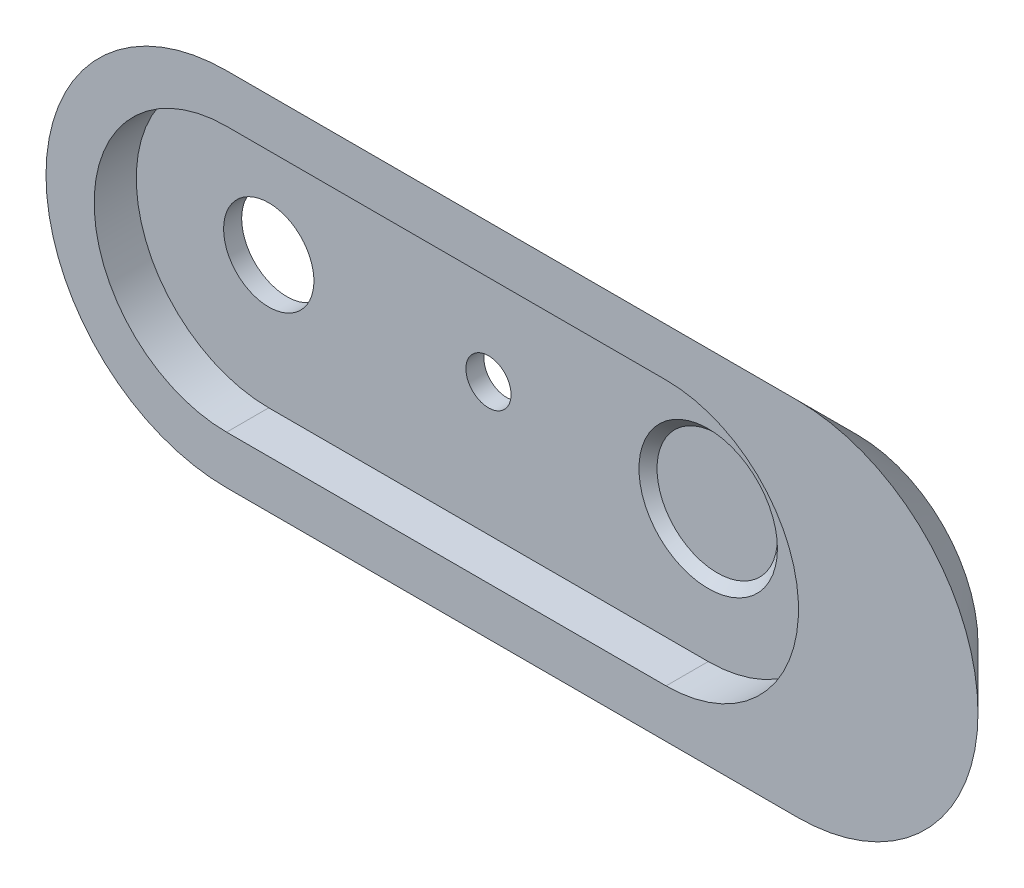
ISO-10303-21;
HEADER;
FILE_DESCRIPTION(('STEP AP214'),'2;1');
FILE_NAME('part.step','',(''),(''),'','','');
FILE_SCHEMA(('AUTOMOTIVE_DESIGN { 1 0 10303 214 1 1 1 1 }'));
ENDSEC;
DATA;
#1=APPLICATION_CONTEXT('core data for automotive mechanical design processes');
#2=APPLICATION_PROTOCOL_DEFINITION('international standard','automotive_design',2000,#1);
#3=PRODUCT_CONTEXT('',#1,'mechanical');
#4=PRODUCT('Part','Part','',(#3));
#5=PRODUCT_RELATED_PRODUCT_CATEGORY('part','',(#4));
#6=PRODUCT_DEFINITION_FORMATION('','',#4);
#7=PRODUCT_DEFINITION_CONTEXT('part definition',#1,'design');
#8=PRODUCT_DEFINITION('design','',#6,#7);
#9=PRODUCT_DEFINITION_SHAPE('','',#8);
#10=(LENGTH_UNIT() NAMED_UNIT(*) SI_UNIT(.MILLI.,.METRE.));
#11=(NAMED_UNIT(*) PLANE_ANGLE_UNIT() SI_UNIT($,.RADIAN.));
#12=(NAMED_UNIT(*) SI_UNIT($,.STERADIAN.) SOLID_ANGLE_UNIT());
#13=UNCERTAINTY_MEASURE_WITH_UNIT(LENGTH_MEASURE(1.E-05),#10,'distance_accuracy_value','');
#14=(GEOMETRIC_REPRESENTATION_CONTEXT(3) GLOBAL_UNCERTAINTY_ASSIGNED_CONTEXT((#13)) GLOBAL_UNIT_ASSIGNED_CONTEXT((#10,
#11,#12)) REPRESENTATION_CONTEXT('',''));
#15=CARTESIAN_POINT('',(0.,0.,0.));
#16=DIRECTION('',(0.,0.,1.));
#17=DIRECTION('',(1.,0.,0.));
#18=AXIS2_PLACEMENT_3D('',#15,#16,#17);
#19=CARTESIAN_POINT('',(-138.851390210462,15.2549340131745,-210.));
#20=DIRECTION('',(0.,0.,1.));
#21=DIRECTION('',(1.,0.,0.));
#22=AXIS2_PLACEMENT_3D('',#19,#20,#21);
#23=PLANE('',#22);
#24=CARTESIAN_POINT('',(-146.202781089905,35.4999999999342,-210.));
#25=DIRECTION('',(0.,0.,-1.));
#26=DIRECTION('',(-1.,0.,0.));
#27=AXIS2_PLACEMENT_3D('',#24,#25,#26);
#28=CIRCLE('',#27,11.);
#29=CARTESIAN_POINT('',(-146.202781089905,46.4999999999342,-210.));
#30=VERTEX_POINT('',#29);
#31=CARTESIAN_POINT('',(-146.202781089905,24.4999999999342,-210.));
#32=VERTEX_POINT('',#31);
#33=EDGE_CURVE('E165',#30,#32,#28,.T.);
#34=ORIENTED_EDGE('',*,*,#33,.T.);
#35=DIRECTION('',(-1.,0.,0.));
#36=VECTOR('',#35,1.);
#37=CARTESIAN_POINT('',(-151.652085650183,24.4999999999342,-210.));
#38=LINE('',#37,#36);
#39=CARTESIAN_POINT('',(-182.702781089905,24.4999999999342,-210.));
#40=VERTEX_POINT('',#39);
#41=EDGE_CURVE('E11',#32,#40,#38,.T.);
#42=ORIENTED_EDGE('',*,*,#41,.T.);
#43=CARTESIAN_POINT('',(-182.702781089905,35.4999999999342,-210.));
#44=DIRECTION('',(0.,0.,-1.));
#45=DIRECTION('',(-1.,0.,0.));
#46=AXIS2_PLACEMENT_3D('',#43,#44,#45);
#47=CIRCLE('',#46,11.);
#48=CARTESIAN_POINT('',(-182.702781089905,46.4999999999342,-210.));
#49=VERTEX_POINT('',#48);
#50=EDGE_CURVE('E204',#40,#49,#47,.T.);
#51=ORIENTED_EDGE('',*,*,#50,.T.);
#52=DIRECTION('',(1.,0.,0.));
#53=VECTOR('',#52,1.);
#54=CARTESIAN_POINT('',(-142.527085650183,46.4999999999342,-210.));
#55=LINE('',#54,#53);
#56=EDGE_CURVE('E185',#49,#30,#55,.T.);
#57=ORIENTED_EDGE('',*,*,#56,.T.);
#58=EDGE_LOOP('',(#34,#42,#51,#57));
#59=FACE_BOUND('',#58,.T.);
#60=DIRECTION('',(-1.,0.,0.));
#61=VECTOR('',#60,1.);
#62=CARTESIAN_POINT('',(-160.77708565018,20.4999999999342,-210.));
#63=LINE('',#62,#61);
#64=CARTESIAN_POINT('',(-135.294643275317,20.4999999999342,-210.));
#65=VERTEX_POINT('',#64);
#66=CARTESIAN_POINT('',(-182.702781089895,20.4999999999342,-210.));
#67=VERTEX_POINT('',#66);
#68=EDGE_CURVE('E241',#65,#67,#63,.T.);
#69=ORIENTED_EDGE('',*,*,#68,.F.);
#70=CARTESIAN_POINT('',(-135.294643275317,35.4999999999342,-210.));
#71=DIRECTION('',(0.,0.,-1.));
#72=DIRECTION('',(1.,0.,0.));
#73=AXIS2_PLACEMENT_3D('',#70,#71,#72);
#74=CIRCLE('',#73,15.);
#75=CARTESIAN_POINT('',(-135.294643275317,50.4999999999342,-210.));
#76=VERTEX_POINT('',#75);
#77=EDGE_CURVE('E77',#76,#65,#74,.T.);
#78=ORIENTED_EDGE('',*,*,#77,.F.);
#79=DIRECTION('',(1.,0.,0.));
#80=VECTOR('',#79,1.);
#81=CARTESIAN_POINT('',(-109.425694770749,50.4999999999342,-210.));
#82=LINE('',#81,#80);
#83=CARTESIAN_POINT('',(-182.702781089914,50.4999999999342,-210.));
#84=VERTEX_POINT('',#83);
#85=EDGE_CURVE('E228',#84,#76,#82,.T.);
#86=ORIENTED_EDGE('',*,*,#85,.F.);
#87=CARTESIAN_POINT('',(-182.702781089905,35.4999999999342,-210.));
#88=DIRECTION('',(0.,0.,-1.));
#89=DIRECTION('',(-6.31531863840943E-13,1.,0.));
#90=AXIS2_PLACEMENT_3D('',#87,#88,#89);
#91=CIRCLE('',#90,15.);
#92=EDGE_CURVE('E235',#67,#84,#91,.T.);
#93=ORIENTED_EDGE('',*,*,#92,.F.);
#94=EDGE_LOOP('',(#69,#78,#86,#93));
#95=FACE_BOUND('',#94,.T.);
#96=ADVANCED_FACE('F49',(#59,#95),#23,.T.);
#97=CARTESIAN_POINT('',(-164.452781089905,24.4999999999342,-210.5));
#98=DIRECTION('',(0.,1.,0.));
#99=DIRECTION('',(1.,0.,0.));
#100=AXIS2_PLACEMENT_3D('',#97,#98,#99);
#101=PLANE('',#100);
#102=ORIENTED_EDGE('',*,*,#41,.F.);
#103=DIRECTION('',(0.,0.,1.));
#104=VECTOR('',#103,1.);
#105=CARTESIAN_POINT('',(-146.202781089905,24.4999999999342,-182.5));
#106=LINE('',#105,#104);
#107=CARTESIAN_POINT('',(-146.202781089905,24.4999999999342,-213.5));
#108=VERTEX_POINT('',#107);
#109=EDGE_CURVE('E58',#108,#32,#106,.T.);
#110=ORIENTED_EDGE('',*,*,#109,.F.);
#111=DIRECTION('',(1.,0.,0.));
#112=VECTOR('',#111,1.);
#113=CARTESIAN_POINT('',(-155.327781089905,24.4999999999342,-213.5));
#114=LINE('',#113,#112);
#115=CARTESIAN_POINT('',(-182.702781089905,24.4999999999342,-213.5));
#116=VERTEX_POINT('',#115);
#117=EDGE_CURVE('E275',#116,#108,#114,.T.);
#118=ORIENTED_EDGE('',*,*,#117,.F.);
#119=DIRECTION('',(0.,0.,-1.));
#120=VECTOR('',#119,1.);
#121=CARTESIAN_POINT('',(-182.702781089905,24.4999999999342,-212.5));
#122=LINE('',#121,#120);
#123=EDGE_CURVE('E207',#40,#116,#122,.T.);
#124=ORIENTED_EDGE('',*,*,#123,.F.);
#125=EDGE_LOOP('',(#102,#110,#118,#124));
#126=FACE_BOUND('',#125,.T.);
#127=ADVANCED_FACE('F326',(#126),#101,.T.);
#128=CARTESIAN_POINT('',(-146.202781089905,35.4999999999342,-182.5));
#129=DIRECTION('',(0.,0.,-1.));
#130=DIRECTION('',(1.,0.,0.));
#131=AXIS2_PLACEMENT_3D('',#128,#129,#130);
#132=CYLINDRICAL_SURFACE('',#131,11.);
#133=ORIENTED_EDGE('',*,*,#33,.F.);
#134=DIRECTION('',(0.,0.,-1.));
#135=VECTOR('',#134,1.);
#136=CARTESIAN_POINT('',(-146.202781089905,46.4999999999342,-212.5));
#137=LINE('',#136,#135);
#138=CARTESIAN_POINT('',(-146.202781089905,46.4999999999342,-213.5));
#139=VERTEX_POINT('',#138);
#140=EDGE_CURVE('E201',#30,#139,#137,.T.);
#141=ORIENTED_EDGE('',*,*,#140,.T.);
#142=CARTESIAN_POINT('',(-146.202781089905,35.4999999999342,-213.5));
#143=DIRECTION('',(0.,0.,-1.));
#144=DIRECTION('',(-1.,0.,0.));
#145=AXIS2_PLACEMENT_3D('',#142,#143,#144);
#146=CIRCLE('',#145,11.);
#147=EDGE_CURVE('E254',#139,#108,#146,.T.);
#148=ORIENTED_EDGE('',*,*,#147,.T.);
#149=ORIENTED_EDGE('',*,*,#109,.T.);
#150=EDGE_LOOP('',(#133,#141,#148,#149));
#151=FACE_BOUND('',#150,.T.);
#152=ADVANCED_FACE('F51',(#151),#132,.F.);
#153=CARTESIAN_POINT('',(-182.702781089905,35.4999999999342,-215.));
#154=DIRECTION('',(0.,0.,1.));
#155=DIRECTION('',(1.,0.,0.));
#156=AXIS2_PLACEMENT_3D('',#153,#154,#155);
#157=CYLINDRICAL_SURFACE('',#156,3.75);
#158=CARTESIAN_POINT('',(-182.702781089905,35.4999999999342,-215.));
#159=DIRECTION('',(0.,0.,1.));
#160=DIRECTION('',(1.,0.,0.));
#161=AXIS2_PLACEMENT_3D('',#158,#159,#160);
#162=CIRCLE('',#161,3.75);
#163=CARTESIAN_POINT('',(-186.452781089905,35.4999999999342,-215.));
#164=VERTEX_POINT('',#163);
#165=EDGE_CURVE('E163',#164,#164,#162,.T.);
#166=ORIENTED_EDGE('',*,*,#165,.F.);
#167=DIRECTION('',(0.,0.,1.));
#168=VECTOR('',#167,1.);
#169=CARTESIAN_POINT('',(-186.452781089905,35.4999999999342,-215.));
#170=LINE('',#169,#168);
#171=CARTESIAN_POINT('',(-186.452781089905,35.4999999999342,-213.5));
#172=VERTEX_POINT('',#171);
#173=EDGE_CURVE('E158',#164,#172,#170,.T.);
#174=ORIENTED_EDGE('',*,*,#173,.T.);
#175=CARTESIAN_POINT('',(-182.702781089905,35.4999999999342,-213.5));
#176=DIRECTION('',(0.,0.,-1.));
#177=DIRECTION('',(1.,0.,0.));
#178=AXIS2_PLACEMENT_3D('',#175,#176,#177);
#179=CIRCLE('',#178,3.75);
#180=EDGE_CURVE('E161',#172,#172,#179,.T.);
#181=ORIENTED_EDGE('',*,*,#180,.F.);
#182=ORIENTED_EDGE('',*,*,#173,.F.);
#183=EDGE_LOOP('',(#166,#174,#181,#182));
#184=FACE_BOUND('',#183,.T.);
#185=ADVANCED_FACE('F160',(#184),#157,.F.);
#186=CARTESIAN_POINT('',(-135.294643275317,35.4999999999342,-212.5));
#187=DIRECTION('',(0.,0.,1.));
#188=DIRECTION('',(1.,0.,0.));
#189=AXIS2_PLACEMENT_3D('',#186,#187,#188);
#190=CONICAL_SURFACE('',#189,12.5,0.785398163397448);
#191=DIRECTION('',(0.,0.707106781186547,-0.707106781186548));
#192=VECTOR('',#191,1.);
#193=CARTESIAN_POINT('',(-135.294643275317,20.4999999999342,-210.));
#194=LINE('',#193,#192);
#195=CARTESIAN_POINT('',(-135.294643275317,25.4999999999342,-215.));
#196=VERTEX_POINT('',#195);
#197=EDGE_CURVE('E238',#65,#196,#194,.T.);
#198=ORIENTED_EDGE('',*,*,#197,.T.);
#199=CARTESIAN_POINT('',(-135.294643275317,35.4999999999342,-215.));
#200=DIRECTION('',(0.,0.,1.));
#201=DIRECTION('',(1.,0.,0.));
#202=AXIS2_PLACEMENT_3D('',#199,#200,#201);
#203=CIRCLE('',#202,10.);
#204=CARTESIAN_POINT('',(-135.294643275317,45.4999999999342,-215.));
#205=VERTEX_POINT('',#204);
#206=EDGE_CURVE('E196',#196,#205,#203,.T.);
#207=ORIENTED_EDGE('',*,*,#206,.T.);
#208=DIRECTION('',(0.,0.707106781186547,0.707106781186548));
#209=VECTOR('',#208,1.);
#210=CARTESIAN_POINT('',(-135.294643275317,45.4999999999342,-215.));
#211=LINE('',#210,#209);
#212=EDGE_CURVE('E220',#205,#76,#211,.T.);
#213=ORIENTED_EDGE('',*,*,#212,.T.);
#214=ORIENTED_EDGE('',*,*,#77,.T.);
#215=EDGE_LOOP('',(#198,#207,#213,#214));
#216=FACE_BOUND('',#215,.T.);
#217=ADVANCED_FACE('F314',(#216),#190,.T.);
#218=CARTESIAN_POINT('',(-160.77708565018,22.9999999999342,-212.5));
#219=DIRECTION('',(0.,-0.707106781186548,-0.707106781186548));
#220=DIRECTION('',(0.,-0.707106781186548,0.707106781186548));
#221=AXIS2_PLACEMENT_3D('',#218,#219,#220);
#222=PLANE('',#221);
#223=ORIENTED_EDGE('',*,*,#197,.F.);
#224=ORIENTED_EDGE('',*,*,#68,.T.);
#225=DIRECTION('',(0.,0.707106781186548,-0.707106781186548));
#226=VECTOR('',#225,1.);
#227=CARTESIAN_POINT('',(-182.702781089895,20.4999999999342,-210.));
#228=LINE('',#227,#226);
#229=CARTESIAN_POINT('',(-182.702781089895,25.4999999999342,-215.));
#230=VERTEX_POINT('',#229);
#231=EDGE_CURVE('E232',#67,#230,#228,.T.);
#232=ORIENTED_EDGE('',*,*,#231,.T.);
#233=DIRECTION('',(1.,0.,0.));
#234=VECTOR('',#233,1.);
#235=CARTESIAN_POINT('',(-160.77708565018,25.4999999999342,-215.));
#236=LINE('',#235,#234);
#237=EDGE_CURVE('E191',#230,#196,#236,.T.);
#238=ORIENTED_EDGE('',*,*,#237,.T.);
#239=EDGE_LOOP('',(#223,#224,#232,#238));
#240=FACE_BOUND('',#239,.T.);
#241=ADVANCED_FACE('F317',(#240),#222,.T.);
#242=CARTESIAN_POINT('',(-182.702781089905,35.4999999999342,-212.5));
#243=DIRECTION('',(0.,0.,1.));
#244=DIRECTION('',(-6.31531863840943E-13,1.,0.));
#245=AXIS2_PLACEMENT_3D('',#242,#243,#244);
#246=CONICAL_SURFACE('',#245,12.5,0.785398163397448);
#247=ORIENTED_EDGE('',*,*,#231,.F.);
#248=ORIENTED_EDGE('',*,*,#92,.T.);
#249=DIRECTION('',(4.46534295249667E-13,-0.707106781186548,-0.707106781186548));
#250=VECTOR('',#249,1.);
#251=CARTESIAN_POINT('',(-182.702781089914,50.4999999999342,-210.));
#252=LINE('',#251,#250);
#253=CARTESIAN_POINT('',(-182.702781089911,45.4999999999342,-215.));
#254=VERTEX_POINT('',#253);
#255=EDGE_CURVE('E223',#84,#254,#252,.T.);
#256=ORIENTED_EDGE('',*,*,#255,.T.);
#257=CARTESIAN_POINT('',(-182.702781089905,35.4999999999342,-215.));
#258=DIRECTION('',(0.,0.,1.));
#259=DIRECTION('',(-6.31531863840943E-13,1.,0.));
#260=AXIS2_PLACEMENT_3D('',#257,#258,#259);
#261=CIRCLE('',#260,10.);
#262=EDGE_CURVE('E195',#254,#230,#261,.T.);
#263=ORIENTED_EDGE('',*,*,#262,.T.);
#264=EDGE_LOOP('',(#247,#248,#256,#263));
#265=FACE_BOUND('',#264,.T.);
#266=ADVANCED_FACE('F321',(#265),#246,.T.);
#267=CARTESIAN_POINT('',(-109.425694770749,47.9999999999342,-212.5));
#268=DIRECTION('',(0.,0.707106781186548,-0.707106781186547));
#269=DIRECTION('',(-1.,0.,0.));
#270=AXIS2_PLACEMENT_3D('',#267,#268,#269);
#271=PLANE('',#270);
#272=ORIENTED_EDGE('',*,*,#212,.F.);
#273=DIRECTION('',(-1.,0.,0.));
#274=VECTOR('',#273,1.);
#275=CARTESIAN_POINT('',(-109.425694770749,45.4999999999342,-215.));
#276=LINE('',#275,#274);
#277=EDGE_CURVE('E216',#205,#254,#276,.T.);
#278=ORIENTED_EDGE('',*,*,#277,.T.);
#279=ORIENTED_EDGE('',*,*,#255,.F.);
#280=ORIENTED_EDGE('',*,*,#85,.T.);
#281=EDGE_LOOP('',(#272,#278,#279,#280));
#282=FACE_BOUND('',#281,.T.);
#283=ADVANCED_FACE('F307',(#282),#271,.T.);
#284=CARTESIAN_POINT('',(-138.851390210465,35.4999999999303,-215.));
#285=DIRECTION('',(0.,0.,1.));
#286=DIRECTION('',(1.,0.,0.));
#287=AXIS2_PLACEMENT_3D('',#284,#285,#286);
#288=PLANE('',#287);
#289=ORIENTED_EDGE('',*,*,#165,.T.);
#290=EDGE_LOOP('',(#289));
#291=FACE_BOUND('',#290,.T.);
#292=CARTESIAN_POINT('',(-164.452781089905,35.4999999999342,-215.));
#293=DIRECTION('',(0.,0.,1.));
#294=DIRECTION('',(1.,0.,0.));
#295=AXIS2_PLACEMENT_3D('',#292,#293,#294);
#296=CIRCLE('',#295,1.875);
#297=CARTESIAN_POINT('',(-166.327781089905,35.4999999999342,-215.));
#298=VERTEX_POINT('',#297);
#299=EDGE_CURVE('E178',#298,#298,#296,.T.);
#300=ORIENTED_EDGE('',*,*,#299,.T.);
#301=EDGE_LOOP('',(#300));
#302=FACE_BOUND('',#301,.T.);
#303=ORIENTED_EDGE('',*,*,#206,.F.);
#304=ORIENTED_EDGE('',*,*,#237,.F.);
#305=ORIENTED_EDGE('',*,*,#262,.F.);
#306=ORIENTED_EDGE('',*,*,#277,.F.);
#307=EDGE_LOOP('',(#303,#304,#305,#306));
#308=FACE_BOUND('',#307,.T.);
#309=ADVANCED_FACE('F303',(#291,#302,#308),#288,.F.);
#310=CARTESIAN_POINT('',(-182.702781089905,35.4999999999342,-212.5));
#311=DIRECTION('',(0.,0.,1.));
#312=DIRECTION('',(-1.,0.,0.));
#313=AXIS2_PLACEMENT_3D('',#310,#311,#312);
#314=CYLINDRICAL_SURFACE('',#313,11.);
#315=ORIENTED_EDGE('',*,*,#50,.F.);
#316=ORIENTED_EDGE('',*,*,#123,.T.);
#317=CARTESIAN_POINT('',(-182.702781089905,35.4999999999342,-213.5));
#318=DIRECTION('',(0.,0.,-1.));
#319=DIRECTION('',(-1.,0.,0.));
#320=AXIS2_PLACEMENT_3D('',#317,#318,#319);
#321=CIRCLE('',#320,11.);
#322=CARTESIAN_POINT('',(-182.702781089905,46.4999999999342,-213.5));
#323=VERTEX_POINT('',#322);
#324=EDGE_CURVE('E172',#116,#323,#321,.T.);
#325=ORIENTED_EDGE('',*,*,#324,.T.);
#326=DIRECTION('',(0.,0.,1.));
#327=VECTOR('',#326,1.);
#328=CARTESIAN_POINT('',(-182.702781089905,46.4999999999342,-212.5));
#329=LINE('',#328,#327);
#330=EDGE_CURVE('E197',#323,#49,#329,.T.);
#331=ORIENTED_EDGE('',*,*,#330,.T.);
#332=EDGE_LOOP('',(#315,#316,#325,#331));
#333=FACE_BOUND('',#332,.T.);
#334=ADVANCED_FACE('F306',(#333),#314,.F.);
#335=CARTESIAN_POINT('',(-146.202781089905,46.4999999999342,-212.5));
#336=DIRECTION('',(0.,1.,0.));
#337=DIRECTION('',(1.,0.,0.));
#338=AXIS2_PLACEMENT_3D('',#335,#336,#337);
#339=PLANE('',#338);
#340=ORIENTED_EDGE('',*,*,#56,.F.);
#341=ORIENTED_EDGE('',*,*,#330,.F.);
#342=DIRECTION('',(1.,0.,0.));
#343=VECTOR('',#342,1.);
#344=CARTESIAN_POINT('',(-146.202781089905,46.4999999999342,-213.5));
#345=LINE('',#344,#343);
#346=EDGE_CURVE('E182',#323,#139,#345,.T.);
#347=ORIENTED_EDGE('',*,*,#346,.T.);
#348=ORIENTED_EDGE('',*,*,#140,.F.);
#349=EDGE_LOOP('',(#340,#341,#347,#348));
#350=FACE_BOUND('',#349,.T.);
#351=ADVANCED_FACE('F354',(#350),#339,.F.);
#352=CARTESIAN_POINT('',(-164.452781089905,35.4999999999342,-215.));
#353=DIRECTION('',(0.,0.,1.));
#354=DIRECTION('',(1.,0.,0.));
#355=AXIS2_PLACEMENT_3D('',#352,#353,#354);
#356=CYLINDRICAL_SURFACE('',#355,1.875);
#357=ORIENTED_EDGE('',*,*,#299,.F.);
#358=DIRECTION('',(0.,0.,1.));
#359=VECTOR('',#358,1.);
#360=CARTESIAN_POINT('',(-166.327781089905,35.4999999999342,-215.));
#361=LINE('',#360,#359);
#362=CARTESIAN_POINT('',(-166.327781089905,35.4999999999342,-213.5));
#363=VERTEX_POINT('',#362);
#364=EDGE_CURVE('E189',#298,#363,#361,.T.);
#365=ORIENTED_EDGE('',*,*,#364,.T.);
#366=CARTESIAN_POINT('',(-164.452781089905,35.4999999999342,-213.5));
#367=DIRECTION('',(0.,0.,1.));
#368=DIRECTION('',(1.,0.,0.));
#369=AXIS2_PLACEMENT_3D('',#366,#367,#368);
#370=CIRCLE('',#369,1.875);
#371=EDGE_CURVE('E171',#363,#363,#370,.T.);
#372=ORIENTED_EDGE('',*,*,#371,.T.);
#373=ORIENTED_EDGE('',*,*,#364,.F.);
#374=EDGE_LOOP('',(#357,#365,#372,#373));
#375=FACE_BOUND('',#374,.T.);
#376=ADVANCED_FACE('F301',(#375),#356,.F.);
#377=CARTESIAN_POINT('',(-146.202781089905,35.4999999999342,-214.25));
#378=DIRECTION('',(0.,0.,1.));
#379=DIRECTION('',(1.,0.,0.));
#380=AXIS2_PLACEMENT_3D('',#377,#378,#379);
#381=PLANE('',#380);
#382=CARTESIAN_POINT('',(-146.202781089905,35.4999999999342,-214.25));
#383=DIRECTION('',(0.,0.,-1.));
#384=DIRECTION('',(-1.,0.,0.));
#385=AXIS2_PLACEMENT_3D('',#382,#383,#384);
#386=CIRCLE('',#385,5.);
#387=CARTESIAN_POINT('',(-141.202781089905,35.4999999999342,-214.25));
#388=VERTEX_POINT('',#387);
#389=EDGE_CURVE('E273',#388,#388,#386,.T.);
#390=ORIENTED_EDGE('',*,*,#389,.F.);
#391=EDGE_LOOP('',(#390));
#392=FACE_BOUND('',#391,.T.);
#393=ADVANCED_FACE('F298',(#392),#381,.T.);
#394=CARTESIAN_POINT('',(-146.202781089905,35.4999999999342,-213.5));
#395=DIRECTION('',(0.,0.,1.));
#396=DIRECTION('',(1.,0.,0.));
#397=AXIS2_PLACEMENT_3D('',#394,#395,#396);
#398=PLANE('',#397);
#399=CARTESIAN_POINT('',(-146.202781089905,35.4999999999342,-213.5));
#400=DIRECTION('',(0.,0.,1.));
#401=DIRECTION('',(-1.,0.,0.));
#402=AXIS2_PLACEMENT_3D('',#399,#400,#401);
#403=CIRCLE('',#402,5.75);
#404=CARTESIAN_POINT('',(-140.452781089905,35.4999999999342,-213.5));
#405=VERTEX_POINT('',#404);
#406=EDGE_CURVE('E287',#405,#405,#403,.T.);
#407=ORIENTED_EDGE('',*,*,#406,.F.);
#408=EDGE_LOOP('',(#407));
#409=FACE_BOUND('',#408,.T.);
#410=ORIENTED_EDGE('',*,*,#371,.F.);
#411=EDGE_LOOP('',(#410));
#412=FACE_BOUND('',#411,.T.);
#413=ORIENTED_EDGE('',*,*,#180,.T.);
#414=EDGE_LOOP('',(#413));
#415=FACE_BOUND('',#414,.T.);
#416=ORIENTED_EDGE('',*,*,#117,.T.);
#417=ORIENTED_EDGE('',*,*,#147,.F.);
#418=ORIENTED_EDGE('',*,*,#346,.F.);
#419=ORIENTED_EDGE('',*,*,#324,.F.);
#420=EDGE_LOOP('',(#416,#417,#418,#419));
#421=FACE_BOUND('',#420,.T.);
#422=ADVANCED_FACE('F168',(#409,#412,#415,#421),#398,.T.);
#423=CARTESIAN_POINT('',(-146.202781089905,35.4999999999342,-213.875));
#424=DIRECTION('',(0.,0.,1.));
#425=DIRECTION('',(-1.,0.,0.));
#426=AXIS2_PLACEMENT_3D('',#423,#424,#425);
#427=CONICAL_SURFACE('',#426,5.375,0.785398163397448);
#428=ORIENTED_EDGE('',*,*,#406,.T.);
#429=DIRECTION('',(-0.707106781186548,0.,-0.707106781186548));
#430=VECTOR('',#429,1.);
#431=CARTESIAN_POINT('',(-140.827781089905,35.4999999999342,-213.875));
#432=LINE('',#431,#430);
#433=EDGE_CURVE('E284',#405,#388,#432,.T.);
#434=ORIENTED_EDGE('',*,*,#433,.T.);
#435=ORIENTED_EDGE('',*,*,#389,.T.);
#436=ORIENTED_EDGE('',*,*,#433,.F.);
#437=EDGE_LOOP('',(#428,#434,#435,#436));
#438=FACE_BOUND('',#437,.T.);
#439=ADVANCED_FACE('F294',(#438),#427,.F.);
#440=CLOSED_SHELL('',(#96,#127,#152,#185,#217,#241,#266,#283,#309,#334,#351,#376,#393,#422,#439));
#441=MANIFOLD_SOLID_BREP('B2',#440);
#442=ADVANCED_BREP_SHAPE_REPRESENTATION('',(#18,#441),#14);
#443=SHAPE_DEFINITION_REPRESENTATION(#9,#442);
ENDSEC;
END-ISO-10303-21;
